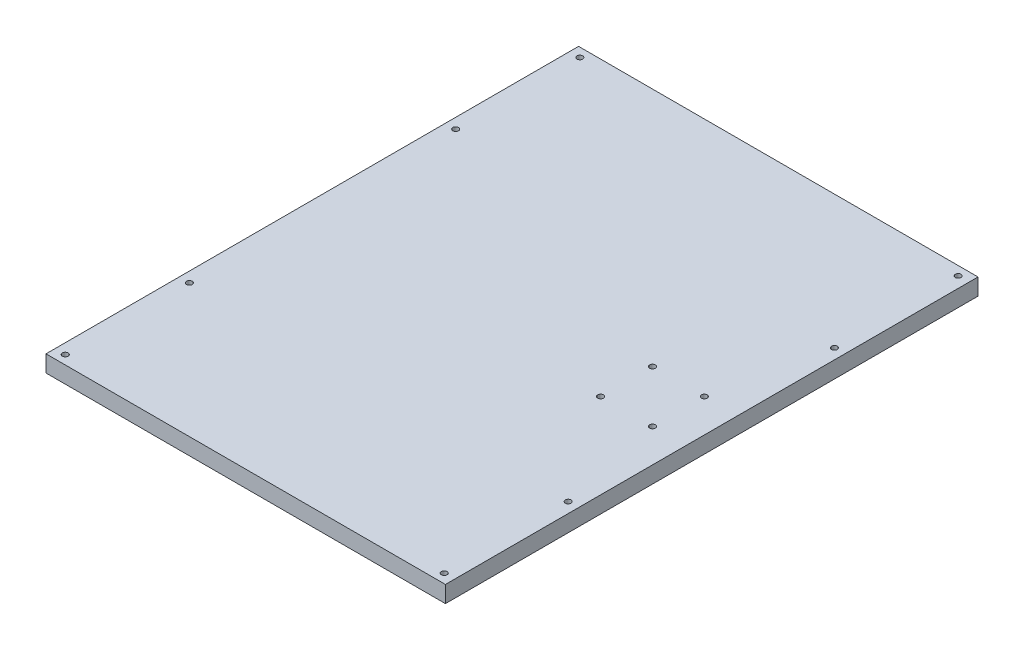
ISO-10303-21;
HEADER;
FILE_DESCRIPTION(('STEP AP214'),'2;1');
FILE_NAME('part.step','',(''),(''),'','','');
FILE_SCHEMA(('AUTOMOTIVE_DESIGN { 1 0 10303 214 1 1 1 1 }'));
ENDSEC;
DATA;
#1=APPLICATION_CONTEXT('core data for automotive mechanical design processes');
#2=APPLICATION_PROTOCOL_DEFINITION('international standard','automotive_design',2000,#1);
#3=PRODUCT_CONTEXT('',#1,'mechanical');
#4=PRODUCT('Part','Part','',(#3));
#5=PRODUCT_RELATED_PRODUCT_CATEGORY('part','',(#4));
#6=PRODUCT_DEFINITION_FORMATION('','',#4);
#7=PRODUCT_DEFINITION_CONTEXT('part definition',#1,'design');
#8=PRODUCT_DEFINITION('design','',#6,#7);
#9=PRODUCT_DEFINITION_SHAPE('','',#8);
#10=(LENGTH_UNIT() NAMED_UNIT(*) SI_UNIT(.MILLI.,.METRE.));
#11=(NAMED_UNIT(*) PLANE_ANGLE_UNIT() SI_UNIT($,.RADIAN.));
#12=(NAMED_UNIT(*) SI_UNIT($,.STERADIAN.) SOLID_ANGLE_UNIT());
#13=UNCERTAINTY_MEASURE_WITH_UNIT(LENGTH_MEASURE(1.E-05),#10,'distance_accuracy_value','');
#14=(GEOMETRIC_REPRESENTATION_CONTEXT(3) GLOBAL_UNCERTAINTY_ASSIGNED_CONTEXT((#13)) GLOBAL_UNIT_ASSIGNED_CONTEXT((#10,
#11,#12)) REPRESENTATION_CONTEXT('',''));
#15=CARTESIAN_POINT('',(0.,0.,0.));
#16=DIRECTION('',(0.,0.,1.));
#17=DIRECTION('',(1.,0.,0.));
#18=AXIS2_PLACEMENT_3D('',#15,#16,#17);
#19=CARTESIAN_POINT('',(0.0247144820528997,6.35,0.));
#20=DIRECTION('',(-1.,0.,0.));
#21=DIRECTION('',(0.,0.,1.));
#22=AXIS2_PLACEMENT_3D('',#19,#20,#21);
#23=PLANE('',#22);
#24=DIRECTION('',(0.,0.,-1.));
#25=VECTOR('',#24,1.);
#26=CARTESIAN_POINT('',(0.0247144820528997,0.,0.));
#27=LINE('',#26,#25);
#28=CARTESIAN_POINT('',(0.0247144820528997,0.,55.1067291757086));
#29=VERTEX_POINT('',#28);
#30=CARTESIAN_POINT('',(0.0247144820528997,0.,-148.093270824291));
#31=VERTEX_POINT('',#30);
#32=EDGE_CURVE('E122',#29,#31,#27,.T.);
#33=ORIENTED_EDGE('',*,*,#32,.F.);
#34=DIRECTION('',(0.,-1.,0.));
#35=VECTOR('',#34,1.);
#36=CARTESIAN_POINT('',(0.0247144820528997,6.35,55.1067291757086));
#37=LINE('',#36,#35);
#38=CARTESIAN_POINT('',(0.0247144820528997,6.35,55.1067291757086));
#39=VERTEX_POINT('',#38);
#40=EDGE_CURVE('E11',#39,#29,#37,.T.);
#41=ORIENTED_EDGE('',*,*,#40,.F.);
#42=DIRECTION('',(0.,0.,-1.));
#43=VECTOR('',#42,1.);
#44=CARTESIAN_POINT('',(0.0247144820528997,6.35,0.));
#45=LINE('',#44,#43);
#46=CARTESIAN_POINT('',(0.0247144820528997,6.35,-148.093270824291));
#47=VERTEX_POINT('',#46);
#48=EDGE_CURVE('E101',#39,#47,#45,.T.);
#49=ORIENTED_EDGE('',*,*,#48,.T.);
#50=DIRECTION('',(0.,-1.,0.));
#51=VECTOR('',#50,1.);
#52=CARTESIAN_POINT('',(0.0247144820528997,6.35,-148.093270824291));
#53=LINE('',#52,#51);
#54=EDGE_CURVE('E82',#47,#31,#53,.T.);
#55=ORIENTED_EDGE('',*,*,#54,.T.);
#56=EDGE_LOOP('',(#33,#41,#49,#55));
#57=FACE_BOUND('',#56,.T.);
#58=ADVANCED_FACE('F42',(#57),#23,.T.);
#59=CARTESIAN_POINT('',(0.,6.35,55.1067291757086));
#60=DIRECTION('',(0.,0.,-1.));
#61=DIRECTION('',(-1.,0.,0.));
#62=AXIS2_PLACEMENT_3D('',#59,#60,#61);
#63=PLANE('',#62);
#64=DIRECTION('',(1.,0.,0.));
#65=VECTOR('',#64,1.);
#66=CARTESIAN_POINT('',(0.,0.,55.1067291757086));
#67=LINE('',#66,#65);
#68=CARTESIAN_POINT('',(152.424714482053,0.,55.1067291757086));
#69=VERTEX_POINT('',#68);
#70=EDGE_CURVE('E107',#29,#69,#67,.T.);
#71=ORIENTED_EDGE('',*,*,#70,.T.);
#72=DIRECTION('',(0.,-1.,0.));
#73=VECTOR('',#72,1.);
#74=CARTESIAN_POINT('',(152.424714482053,6.35,55.1067291757086));
#75=LINE('',#74,#73);
#76=CARTESIAN_POINT('',(152.424714482053,6.35,55.1067291757086));
#77=VERTEX_POINT('',#76);
#78=EDGE_CURVE('E52',#77,#69,#75,.T.);
#79=ORIENTED_EDGE('',*,*,#78,.F.);
#80=DIRECTION('',(1.,0.,0.));
#81=VECTOR('',#80,1.);
#82=CARTESIAN_POINT('',(0.,6.35,55.1067291757086));
#83=LINE('',#82,#81);
#84=EDGE_CURVE('E98',#39,#77,#83,.T.);
#85=ORIENTED_EDGE('',*,*,#84,.F.);
#86=ORIENTED_EDGE('',*,*,#40,.T.);
#87=EDGE_LOOP('',(#71,#79,#85,#86));
#88=FACE_BOUND('',#87,.T.);
#89=ADVANCED_FACE('F105',(#88),#63,.F.);
#90=CARTESIAN_POINT('',(152.424714482053,6.35,0.));
#91=DIRECTION('',(-1.,0.,0.));
#92=DIRECTION('',(0.,0.,1.));
#93=AXIS2_PLACEMENT_3D('',#90,#91,#92);
#94=PLANE('',#93);
#95=DIRECTION('',(0.,0.,-1.));
#96=VECTOR('',#95,1.);
#97=CARTESIAN_POINT('',(152.424714482053,0.,0.));
#98=LINE('',#97,#96);
#99=CARTESIAN_POINT('',(152.424714482053,0.,-148.093270824291));
#100=VERTEX_POINT('',#99);
#101=EDGE_CURVE('E117',#69,#100,#98,.T.);
#102=ORIENTED_EDGE('',*,*,#101,.T.);
#103=DIRECTION('',(0.,-1.,0.));
#104=VECTOR('',#103,1.);
#105=CARTESIAN_POINT('',(152.424714482053,6.35,-148.093270824291));
#106=LINE('',#105,#104);
#107=CARTESIAN_POINT('',(152.424714482053,6.35,-148.093270824291));
#108=VERTEX_POINT('',#107);
#109=EDGE_CURVE('E96',#108,#100,#106,.T.);
#110=ORIENTED_EDGE('',*,*,#109,.F.);
#111=DIRECTION('',(0.,0.,-1.));
#112=VECTOR('',#111,1.);
#113=CARTESIAN_POINT('',(152.424714482053,6.35,0.));
#114=LINE('',#113,#112);
#115=EDGE_CURVE('E90',#77,#108,#114,.T.);
#116=ORIENTED_EDGE('',*,*,#115,.F.);
#117=ORIENTED_EDGE('',*,*,#78,.T.);
#118=EDGE_LOOP('',(#102,#110,#116,#117));
#119=FACE_BOUND('',#118,.T.);
#120=ADVANCED_FACE('F93',(#119),#94,.F.);
#121=CARTESIAN_POINT('',(3.936211838,6.35,-144.658604846291));
#122=DIRECTION('',(0.,-1.,0.));
#123=DIRECTION('',(0.,0.,-1.));
#124=AXIS2_PLACEMENT_3D('',#121,#122,#123);
#125=CYLINDRICAL_SURFACE('',#124,1.09999999999998);
#126=CARTESIAN_POINT('',(3.936211838,6.35,-144.658604846291));
#127=DIRECTION('',(0.,1.,0.));
#128=DIRECTION('',(0.,0.,1.));
#129=AXIS2_PLACEMENT_3D('',#126,#127,#128);
#130=CIRCLE('',#129,1.09999999999998);
#131=CARTESIAN_POINT('',(3.936211838,6.35,-143.558604846291));
#132=VERTEX_POINT('',#131);
#133=EDGE_CURVE('E162',#132,#132,#130,.T.);
#134=ORIENTED_EDGE('',*,*,#133,.T.);
#135=EDGE_LOOP('',(#134));
#136=FACE_BOUND('',#135,.T.);
#137=CARTESIAN_POINT('',(3.936211838,0.,-144.658604846291));
#138=DIRECTION('',(0.,1.,0.));
#139=DIRECTION('',(0.,0.,1.));
#140=AXIS2_PLACEMENT_3D('',#137,#138,#139);
#141=CIRCLE('',#140,1.09999999999998);
#142=CARTESIAN_POINT('',(3.936211838,0.,-143.558604846291));
#143=VERTEX_POINT('',#142);
#144=EDGE_CURVE('E125',#143,#143,#141,.T.);
#145=ORIENTED_EDGE('',*,*,#144,.F.);
#146=EDGE_LOOP('',(#145));
#147=FACE_BOUND('',#146,.T.);
#148=ADVANCED_FACE('F259',(#136,#147),#125,.F.);
#149=CARTESIAN_POINT('',(3.936211838,6.35,51.6720631977086));
#150=DIRECTION('',(0.,-1.,0.));
#151=DIRECTION('',(0.,0.,-1.));
#152=AXIS2_PLACEMENT_3D('',#149,#150,#151);
#153=CYLINDRICAL_SURFACE('',#152,1.1);
#154=CARTESIAN_POINT('',(3.936211838,6.35,51.6720631977086));
#155=DIRECTION('',(0.,1.,0.));
#156=DIRECTION('',(0.,0.,1.));
#157=AXIS2_PLACEMENT_3D('',#154,#155,#156);
#158=CIRCLE('',#157,1.1);
#159=CARTESIAN_POINT('',(3.936211838,6.35,52.7720631977086));
#160=VERTEX_POINT('',#159);
#161=EDGE_CURVE('E166',#160,#160,#158,.T.);
#162=ORIENTED_EDGE('',*,*,#161,.T.);
#163=EDGE_LOOP('',(#162));
#164=FACE_BOUND('',#163,.T.);
#165=CARTESIAN_POINT('',(3.936211838,0.,51.6720631977086));
#166=DIRECTION('',(0.,1.,0.));
#167=DIRECTION('',(0.,0.,1.));
#168=AXIS2_PLACEMENT_3D('',#165,#166,#167);
#169=CIRCLE('',#168,1.1);
#170=CARTESIAN_POINT('',(3.936211838,0.,52.7720631977086));
#171=VERTEX_POINT('',#170);
#172=EDGE_CURVE('E129',#171,#171,#169,.T.);
#173=ORIENTED_EDGE('',*,*,#172,.F.);
#174=EDGE_LOOP('',(#173));
#175=FACE_BOUND('',#174,.T.);
#176=ADVANCED_FACE('F262',(#164,#175),#153,.F.);
#177=CARTESIAN_POINT('',(148.463788162,6.35,51.6013370121473));
#178=DIRECTION('',(0.,-1.,0.));
#179=DIRECTION('',(0.,0.,-1.));
#180=AXIS2_PLACEMENT_3D('',#177,#178,#179);
#181=CYLINDRICAL_SURFACE('',#180,1.09999999999999);
#182=CARTESIAN_POINT('',(148.463788162,6.35,51.6013370121473));
#183=DIRECTION('',(0.,1.,0.));
#184=DIRECTION('',(0.,0.,1.));
#185=AXIS2_PLACEMENT_3D('',#182,#183,#184);
#186=CIRCLE('',#185,1.09999999999999);
#187=CARTESIAN_POINT('',(148.463788162,6.35,52.7013370121473));
#188=VERTEX_POINT('',#187);
#189=EDGE_CURVE('E170',#188,#188,#186,.T.);
#190=ORIENTED_EDGE('',*,*,#189,.T.);
#191=EDGE_LOOP('',(#190));
#192=FACE_BOUND('',#191,.T.);
#193=CARTESIAN_POINT('',(148.463788162,0.,51.6013370121473));
#194=DIRECTION('',(0.,1.,0.));
#195=DIRECTION('',(0.,0.,1.));
#196=AXIS2_PLACEMENT_3D('',#193,#194,#195);
#197=CIRCLE('',#196,1.09999999999999);
#198=CARTESIAN_POINT('',(148.463788162,0.,52.7013370121473));
#199=VERTEX_POINT('',#198);
#200=EDGE_CURVE('E133',#199,#199,#197,.T.);
#201=ORIENTED_EDGE('',*,*,#200,.F.);
#202=EDGE_LOOP('',(#201));
#203=FACE_BOUND('',#202,.T.);
#204=ADVANCED_FACE('F279',(#192,#203),#181,.F.);
#205=CARTESIAN_POINT('',(148.291793945178,6.35,-144.658604846291));
#206=DIRECTION('',(0.,-1.,0.));
#207=DIRECTION('',(0.,0.,-1.));
#208=AXIS2_PLACEMENT_3D('',#205,#206,#207);
#209=CYLINDRICAL_SURFACE('',#208,1.09999999999999);
#210=CARTESIAN_POINT('',(148.291793945178,6.35,-144.658604846291));
#211=DIRECTION('',(0.,1.,0.));
#212=DIRECTION('',(0.,0.,1.));
#213=AXIS2_PLACEMENT_3D('',#210,#211,#212);
#214=CIRCLE('',#213,1.09999999999999);
#215=CARTESIAN_POINT('',(148.291793945178,6.35,-143.558604846291));
#216=VERTEX_POINT('',#215);
#217=EDGE_CURVE('E174',#216,#216,#214,.T.);
#218=ORIENTED_EDGE('',*,*,#217,.T.);
#219=EDGE_LOOP('',(#218));
#220=FACE_BOUND('',#219,.T.);
#221=CARTESIAN_POINT('',(148.291793945178,0.,-144.658604846291));
#222=DIRECTION('',(0.,1.,0.));
#223=DIRECTION('',(0.,0.,1.));
#224=AXIS2_PLACEMENT_3D('',#221,#222,#223);
#225=CIRCLE('',#224,1.09999999999999);
#226=CARTESIAN_POINT('',(148.291793945178,0.,-143.558604846291));
#227=VERTEX_POINT('',#226);
#228=EDGE_CURVE('E137',#227,#227,#225,.T.);
#229=ORIENTED_EDGE('',*,*,#228,.F.);
#230=EDGE_LOOP('',(#229));
#231=FACE_BOUND('',#230,.T.);
#232=ADVANCED_FACE('F283',(#220,#231),#209,.F.);
#233=CARTESIAN_POINT('',(148.463788162,6.35,-97.2932708242914));
#234=DIRECTION('',(0.,-1.,0.));
#235=DIRECTION('',(0.,0.,-1.));
#236=AXIS2_PLACEMENT_3D('',#233,#234,#235);
#237=CYLINDRICAL_SURFACE('',#236,1.09999999999999);
#238=CARTESIAN_POINT('',(148.463788162,6.35,-97.2932708242914));
#239=DIRECTION('',(0.,1.,0.));
#240=DIRECTION('',(0.,0.,1.));
#241=AXIS2_PLACEMENT_3D('',#238,#239,#240);
#242=CIRCLE('',#241,1.09999999999999);
#243=CARTESIAN_POINT('',(148.463788162,6.35,-96.1932708242914));
#244=VERTEX_POINT('',#243);
#245=EDGE_CURVE('E178',#244,#244,#242,.T.);
#246=ORIENTED_EDGE('',*,*,#245,.T.);
#247=EDGE_LOOP('',(#246));
#248=FACE_BOUND('',#247,.T.);
#249=CARTESIAN_POINT('',(148.463788162,0.,-97.2932708242914));
#250=DIRECTION('',(0.,1.,0.));
#251=DIRECTION('',(0.,0.,1.));
#252=AXIS2_PLACEMENT_3D('',#249,#250,#251);
#253=CIRCLE('',#252,1.09999999999999);
#254=CARTESIAN_POINT('',(148.463788162,0.,-96.1932708242914));
#255=VERTEX_POINT('',#254);
#256=EDGE_CURVE('E141',#255,#255,#253,.T.);
#257=ORIENTED_EDGE('',*,*,#256,.F.);
#258=EDGE_LOOP('',(#257));
#259=FACE_BOUND('',#258,.T.);
#260=ADVANCED_FACE('F287',(#248,#259),#237,.F.);
#261=CARTESIAN_POINT('',(148.463788162,6.35,4.30672917570856));
#262=DIRECTION('',(0.,-1.,0.));
#263=DIRECTION('',(0.,0.,-1.));
#264=AXIS2_PLACEMENT_3D('',#261,#262,#263);
#265=CYLINDRICAL_SURFACE('',#264,1.09999999999999);
#266=CARTESIAN_POINT('',(148.463788162,6.35,4.30672917570856));
#267=DIRECTION('',(0.,1.,0.));
#268=DIRECTION('',(0.,0.,1.));
#269=AXIS2_PLACEMENT_3D('',#266,#267,#268);
#270=CIRCLE('',#269,1.09999999999999);
#271=CARTESIAN_POINT('',(148.463788162,6.35,5.40672917570855));
#272=VERTEX_POINT('',#271);
#273=EDGE_CURVE('E182',#272,#272,#270,.T.);
#274=ORIENTED_EDGE('',*,*,#273,.T.);
#275=EDGE_LOOP('',(#274));
#276=FACE_BOUND('',#275,.T.);
#277=CARTESIAN_POINT('',(148.463788162,0.,4.30672917570856));
#278=DIRECTION('',(0.,1.,0.));
#279=DIRECTION('',(0.,0.,1.));
#280=AXIS2_PLACEMENT_3D('',#277,#278,#279);
#281=CIRCLE('',#280,1.09999999999999);
#282=CARTESIAN_POINT('',(148.463788162,0.,5.40672917570855));
#283=VERTEX_POINT('',#282);
#284=EDGE_CURVE('E145',#283,#283,#281,.T.);
#285=ORIENTED_EDGE('',*,*,#284,.F.);
#286=EDGE_LOOP('',(#285));
#287=FACE_BOUND('',#286,.T.);
#288=ADVANCED_FACE('F291',(#276,#287),#265,.F.);
#289=CARTESIAN_POINT('',(3.93621183800002,6.35,4.30672917570857));
#290=DIRECTION('',(0.,-1.,0.));
#291=DIRECTION('',(0.,0.,-1.));
#292=AXIS2_PLACEMENT_3D('',#289,#290,#291);
#293=CYLINDRICAL_SURFACE('',#292,1.1);
#294=CARTESIAN_POINT('',(3.93621183800002,6.35,4.30672917570857));
#295=DIRECTION('',(0.,1.,0.));
#296=DIRECTION('',(0.,0.,1.));
#297=AXIS2_PLACEMENT_3D('',#294,#295,#296);
#298=CIRCLE('',#297,1.1);
#299=CARTESIAN_POINT('',(3.93621183800002,6.35,5.40672917570858));
#300=VERTEX_POINT('',#299);
#301=EDGE_CURVE('E186',#300,#300,#298,.T.);
#302=ORIENTED_EDGE('',*,*,#301,.T.);
#303=EDGE_LOOP('',(#302));
#304=FACE_BOUND('',#303,.T.);
#305=CARTESIAN_POINT('',(3.93621183800002,0.,4.30672917570857));
#306=DIRECTION('',(0.,1.,0.));
#307=DIRECTION('',(0.,0.,1.));
#308=AXIS2_PLACEMENT_3D('',#305,#306,#307);
#309=CIRCLE('',#308,1.1);
#310=CARTESIAN_POINT('',(3.93621183800002,0.,5.40672917570858));
#311=VERTEX_POINT('',#310);
#312=EDGE_CURVE('E149',#311,#311,#309,.T.);
#313=ORIENTED_EDGE('',*,*,#312,.F.);
#314=EDGE_LOOP('',(#313));
#315=FACE_BOUND('',#314,.T.);
#316=ADVANCED_FACE('F294',(#304,#315),#293,.F.);
#317=CARTESIAN_POINT('',(3.936211838,6.35,-97.2932708242914));
#318=DIRECTION('',(0.,-1.,0.));
#319=DIRECTION('',(0.,0.,-1.));
#320=AXIS2_PLACEMENT_3D('',#317,#318,#319);
#321=CYLINDRICAL_SURFACE('',#320,1.1);
#322=CARTESIAN_POINT('',(3.936211838,6.35,-97.2932708242914));
#323=DIRECTION('',(0.,1.,0.));
#324=DIRECTION('',(0.,0.,1.));
#325=AXIS2_PLACEMENT_3D('',#322,#323,#324);
#326=CIRCLE('',#325,1.1);
#327=CARTESIAN_POINT('',(3.936211838,6.35,-96.1932708242914));
#328=VERTEX_POINT('',#327);
#329=EDGE_CURVE('E116',#328,#328,#326,.T.);
#330=ORIENTED_EDGE('',*,*,#329,.T.);
#331=EDGE_LOOP('',(#330));
#332=FACE_BOUND('',#331,.T.);
#333=CARTESIAN_POINT('',(3.936211838,0.,-97.2932708242914));
#334=DIRECTION('',(0.,1.,0.));
#335=DIRECTION('',(0.,0.,1.));
#336=AXIS2_PLACEMENT_3D('',#333,#334,#335);
#337=CIRCLE('',#336,1.1);
#338=CARTESIAN_POINT('',(3.936211838,0.,-96.1932708242914));
#339=VERTEX_POINT('',#338);
#340=EDGE_CURVE('E153',#339,#339,#337,.T.);
#341=ORIENTED_EDGE('',*,*,#340,.F.);
#342=EDGE_LOOP('',(#341));
#343=FACE_BOUND('',#342,.T.);
#344=ADVANCED_FACE('F44',(#332,#343),#321,.F.);
#345=CARTESIAN_POINT('',(0.,6.35,-148.093270824291));
#346=DIRECTION('',(0.,0.,1.));
#347=DIRECTION('',(1.,0.,0.));
#348=AXIS2_PLACEMENT_3D('',#345,#346,#347);
#349=PLANE('',#348);
#350=DIRECTION('',(-1.,0.,0.));
#351=VECTOR('',#350,1.);
#352=CARTESIAN_POINT('',(0.,0.,-148.093270824291));
#353=LINE('',#352,#351);
#354=EDGE_CURVE('E75',#100,#31,#353,.T.);
#355=ORIENTED_EDGE('',*,*,#354,.T.);
#356=ORIENTED_EDGE('',*,*,#54,.F.);
#357=DIRECTION('',(-1.,0.,0.));
#358=VECTOR('',#357,1.);
#359=CARTESIAN_POINT('',(0.,6.35,-148.093270824291));
#360=LINE('',#359,#358);
#361=EDGE_CURVE('E60',#108,#47,#360,.T.);
#362=ORIENTED_EDGE('',*,*,#361,.F.);
#363=ORIENTED_EDGE('',*,*,#109,.T.);
#364=EDGE_LOOP('',(#355,#356,#362,#363));
#365=FACE_BOUND('',#364,.T.);
#366=ADVANCED_FACE('F238',(#365),#349,.F.);
#367=CARTESIAN_POINT('',(0.,6.35,0.));
#368=DIRECTION('',(0.,1.,0.));
#369=DIRECTION('',(0.,0.,1.));
#370=AXIS2_PLACEMENT_3D('',#367,#368,#369);
#371=PLANE('',#370);
#372=CARTESIAN_POINT('',(139.724714482053,6.35,-56.3932708242914));
#373=DIRECTION('',(0.,1.,0.));
#374=DIRECTION('',(0.,0.,1.));
#375=AXIS2_PLACEMENT_3D('',#372,#373,#374);
#376=CIRCLE('',#375,1.09999999999999);
#377=CARTESIAN_POINT('',(139.724714482053,6.35,-55.2932708242914));
#378=VERTEX_POINT('',#377);
#379=EDGE_CURVE('E201',#378,#378,#376,.T.);
#380=ORIENTED_EDGE('',*,*,#379,.F.);
#381=EDGE_LOOP('',(#380));
#382=FACE_BOUND('',#381,.T.);
#383=CARTESIAN_POINT('',(139.724714482053,6.35,-36.5932708242914));
#384=DIRECTION('',(0.,1.,0.));
#385=DIRECTION('',(0.,0.,1.));
#386=AXIS2_PLACEMENT_3D('',#383,#384,#385);
#387=CIRCLE('',#386,1.09999999999999);
#388=CARTESIAN_POINT('',(139.724714482053,6.35,-35.4932708242914));
#389=VERTEX_POINT('',#388);
#390=EDGE_CURVE('E209',#389,#389,#387,.T.);
#391=ORIENTED_EDGE('',*,*,#390,.F.);
#392=EDGE_LOOP('',(#391));
#393=FACE_BOUND('',#392,.T.);
#394=CARTESIAN_POINT('',(119.924714482053,6.35,-36.5932708242914));
#395=DIRECTION('',(0.,1.,0.));
#396=DIRECTION('',(0.,0.,1.));
#397=AXIS2_PLACEMENT_3D('',#394,#395,#396);
#398=CIRCLE('',#397,1.10000000000001);
#399=CARTESIAN_POINT('',(119.924714482053,6.35,-35.4932708242914));
#400=VERTEX_POINT('',#399);
#401=EDGE_CURVE('E217',#400,#400,#398,.T.);
#402=ORIENTED_EDGE('',*,*,#401,.F.);
#403=EDGE_LOOP('',(#402));
#404=FACE_BOUND('',#403,.T.);
#405=CARTESIAN_POINT('',(119.924714482053,6.35,-56.3932708242914));
#406=DIRECTION('',(0.,1.,0.));
#407=DIRECTION('',(0.,0.,1.));
#408=AXIS2_PLACEMENT_3D('',#405,#406,#407);
#409=CIRCLE('',#408,1.10000000000001);
#410=CARTESIAN_POINT('',(119.924714482053,6.35,-55.2932708242914));
#411=VERTEX_POINT('',#410);
#412=EDGE_CURVE('E193',#411,#411,#409,.T.);
#413=ORIENTED_EDGE('',*,*,#412,.F.);
#414=EDGE_LOOP('',(#413));
#415=FACE_BOUND('',#414,.T.);
#416=ORIENTED_EDGE('',*,*,#329,.F.);
#417=EDGE_LOOP('',(#416));
#418=FACE_BOUND('',#417,.T.);
#419=ORIENTED_EDGE('',*,*,#301,.F.);
#420=EDGE_LOOP('',(#419));
#421=FACE_BOUND('',#420,.T.);
#422=ORIENTED_EDGE('',*,*,#273,.F.);
#423=EDGE_LOOP('',(#422));
#424=FACE_BOUND('',#423,.T.);
#425=ORIENTED_EDGE('',*,*,#245,.F.);
#426=EDGE_LOOP('',(#425));
#427=FACE_BOUND('',#426,.T.);
#428=ORIENTED_EDGE('',*,*,#217,.F.);
#429=EDGE_LOOP('',(#428));
#430=FACE_BOUND('',#429,.T.);
#431=ORIENTED_EDGE('',*,*,#189,.F.);
#432=EDGE_LOOP('',(#431));
#433=FACE_BOUND('',#432,.T.);
#434=ORIENTED_EDGE('',*,*,#161,.F.);
#435=EDGE_LOOP('',(#434));
#436=FACE_BOUND('',#435,.T.);
#437=ORIENTED_EDGE('',*,*,#133,.F.);
#438=EDGE_LOOP('',(#437));
#439=FACE_BOUND('',#438,.T.);
#440=ORIENTED_EDGE('',*,*,#48,.F.);
#441=ORIENTED_EDGE('',*,*,#84,.T.);
#442=ORIENTED_EDGE('',*,*,#115,.T.);
#443=ORIENTED_EDGE('',*,*,#361,.T.);
#444=EDGE_LOOP('',(#440,#441,#442,#443));
#445=FACE_BOUND('',#444,.T.);
#446=ADVANCED_FACE('F100',(#382,#393,#404,#415,#418,#421,#424,#427,#430,#433,#436,#439,#445),
#371,.T.);
#447=CARTESIAN_POINT('',(0.,0.,0.));
#448=DIRECTION('',(0.,1.,0.));
#449=DIRECTION('',(0.,0.,1.));
#450=AXIS2_PLACEMENT_3D('',#447,#448,#449);
#451=PLANE('',#450);
#452=CARTESIAN_POINT('',(139.724714482053,0.,-56.3932708242914));
#453=DIRECTION('',(0.,1.,0.));
#454=DIRECTION('',(0.,0.,1.));
#455=AXIS2_PLACEMENT_3D('',#452,#453,#454);
#456=CIRCLE('',#455,1.09999999999999);
#457=CARTESIAN_POINT('',(139.724714482053,0.,-55.2932708242914));
#458=VERTEX_POINT('',#457);
#459=EDGE_CURVE('E205',#458,#458,#456,.T.);
#460=ORIENTED_EDGE('',*,*,#459,.T.);
#461=EDGE_LOOP('',(#460));
#462=FACE_BOUND('',#461,.T.);
#463=CARTESIAN_POINT('',(139.724714482053,0.,-36.5932708242914));
#464=DIRECTION('',(0.,1.,0.));
#465=DIRECTION('',(0.,0.,1.));
#466=AXIS2_PLACEMENT_3D('',#463,#464,#465);
#467=CIRCLE('',#466,1.09999999999999);
#468=CARTESIAN_POINT('',(139.724714482053,0.,-35.4932708242914));
#469=VERTEX_POINT('',#468);
#470=EDGE_CURVE('E213',#469,#469,#467,.T.);
#471=ORIENTED_EDGE('',*,*,#470,.T.);
#472=EDGE_LOOP('',(#471));
#473=FACE_BOUND('',#472,.T.);
#474=CARTESIAN_POINT('',(119.924714482053,0.,-36.5932708242914));
#475=DIRECTION('',(0.,1.,0.));
#476=DIRECTION('',(0.,0.,1.));
#477=AXIS2_PLACEMENT_3D('',#474,#475,#476);
#478=CIRCLE('',#477,1.10000000000001);
#479=CARTESIAN_POINT('',(119.924714482053,0.,-35.4932708242914));
#480=VERTEX_POINT('',#479);
#481=EDGE_CURVE('E197',#480,#480,#478,.T.);
#482=ORIENTED_EDGE('',*,*,#481,.T.);
#483=EDGE_LOOP('',(#482));
#484=FACE_BOUND('',#483,.T.);
#485=CARTESIAN_POINT('',(119.924714482053,0.,-56.3932708242914));
#486=DIRECTION('',(0.,1.,0.));
#487=DIRECTION('',(0.,0.,1.));
#488=AXIS2_PLACEMENT_3D('',#485,#486,#487);
#489=CIRCLE('',#488,1.10000000000001);
#490=CARTESIAN_POINT('',(119.924714482053,0.,-55.2932708242914));
#491=VERTEX_POINT('',#490);
#492=EDGE_CURVE('E157',#491,#491,#489,.T.);
#493=ORIENTED_EDGE('',*,*,#492,.T.);
#494=EDGE_LOOP('',(#493));
#495=FACE_BOUND('',#494,.T.);
#496=ORIENTED_EDGE('',*,*,#340,.T.);
#497=EDGE_LOOP('',(#496));
#498=FACE_BOUND('',#497,.T.);
#499=ORIENTED_EDGE('',*,*,#312,.T.);
#500=EDGE_LOOP('',(#499));
#501=FACE_BOUND('',#500,.T.);
#502=ORIENTED_EDGE('',*,*,#284,.T.);
#503=EDGE_LOOP('',(#502));
#504=FACE_BOUND('',#503,.T.);
#505=ORIENTED_EDGE('',*,*,#256,.T.);
#506=EDGE_LOOP('',(#505));
#507=FACE_BOUND('',#506,.T.);
#508=ORIENTED_EDGE('',*,*,#228,.T.);
#509=EDGE_LOOP('',(#508));
#510=FACE_BOUND('',#509,.T.);
#511=ORIENTED_EDGE('',*,*,#200,.T.);
#512=EDGE_LOOP('',(#511));
#513=FACE_BOUND('',#512,.T.);
#514=ORIENTED_EDGE('',*,*,#172,.T.);
#515=EDGE_LOOP('',(#514));
#516=FACE_BOUND('',#515,.T.);
#517=ORIENTED_EDGE('',*,*,#144,.T.);
#518=EDGE_LOOP('',(#517));
#519=FACE_BOUND('',#518,.T.);
#520=ORIENTED_EDGE('',*,*,#32,.T.);
#521=ORIENTED_EDGE('',*,*,#354,.F.);
#522=ORIENTED_EDGE('',*,*,#101,.F.);
#523=ORIENTED_EDGE('',*,*,#70,.F.);
#524=EDGE_LOOP('',(#520,#521,#522,#523));
#525=FACE_BOUND('',#524,.T.);
#526=ADVANCED_FACE('F225',(#462,#473,#484,#495,#498,#501,#504,#507,#510,#513,#516,#519,#525),
#451,.F.);
#527=CARTESIAN_POINT('',(119.924714482053,0.,-56.3932708242914));
#528=DIRECTION('',(0.,1.,0.));
#529=DIRECTION('',(0.,0.,1.));
#530=AXIS2_PLACEMENT_3D('',#527,#528,#529);
#531=CYLINDRICAL_SURFACE('',#530,1.10000000000001);
#532=ORIENTED_EDGE('',*,*,#492,.F.);
#533=EDGE_LOOP('',(#532));
#534=FACE_BOUND('',#533,.T.);
#535=ORIENTED_EDGE('',*,*,#412,.T.);
#536=EDGE_LOOP('',(#535));
#537=FACE_BOUND('',#536,.T.);
#538=ADVANCED_FACE('F232',(#534,#537),#531,.F.);
#539=CARTESIAN_POINT('',(119.924714482053,0.,-36.5932708242914));
#540=DIRECTION('',(0.,1.,0.));
#541=DIRECTION('',(0.,0.,1.));
#542=AXIS2_PLACEMENT_3D('',#539,#540,#541);
#543=CYLINDRICAL_SURFACE('',#542,1.10000000000001);
#544=ORIENTED_EDGE('',*,*,#481,.F.);
#545=EDGE_LOOP('',(#544));
#546=FACE_BOUND('',#545,.T.);
#547=ORIENTED_EDGE('',*,*,#401,.T.);
#548=EDGE_LOOP('',(#547));
#549=FACE_BOUND('',#548,.T.);
#550=ADVANCED_FACE('F228',(#546,#549),#543,.F.);
#551=CARTESIAN_POINT('',(139.724714482053,0.,-36.5932708242914));
#552=DIRECTION('',(0.,1.,0.));
#553=DIRECTION('',(0.,0.,1.));
#554=AXIS2_PLACEMENT_3D('',#551,#552,#553);
#555=CYLINDRICAL_SURFACE('',#554,1.09999999999999);
#556=ORIENTED_EDGE('',*,*,#470,.F.);
#557=EDGE_LOOP('',(#556));
#558=FACE_BOUND('',#557,.T.);
#559=ORIENTED_EDGE('',*,*,#390,.T.);
#560=EDGE_LOOP('',(#559));
#561=FACE_BOUND('',#560,.T.);
#562=ADVANCED_FACE('F231',(#558,#561),#555,.F.);
#563=CARTESIAN_POINT('',(139.724714482053,0.,-56.3932708242914));
#564=DIRECTION('',(0.,1.,0.));
#565=DIRECTION('',(0.,0.,1.));
#566=AXIS2_PLACEMENT_3D('',#563,#564,#565);
#567=CYLINDRICAL_SURFACE('',#566,1.09999999999999);
#568=ORIENTED_EDGE('',*,*,#459,.F.);
#569=EDGE_LOOP('',(#568));
#570=FACE_BOUND('',#569,.T.);
#571=ORIENTED_EDGE('',*,*,#379,.T.);
#572=EDGE_LOOP('',(#571));
#573=FACE_BOUND('',#572,.T.);
#574=ADVANCED_FACE('F415',(#570,#573),#567,.F.);
#575=CLOSED_SHELL('',(#58,#89,#120,#148,#176,#204,#232,#260,#288,#316,#344,#366,#446,#526,#538,
#550,#562,#574));
#576=MANIFOLD_SOLID_BREP('B2',#575);
#577=ADVANCED_BREP_SHAPE_REPRESENTATION('',(#18,#576),#14);
#578=SHAPE_DEFINITION_REPRESENTATION(#9,#577);
ENDSEC;
END-ISO-10303-21;
